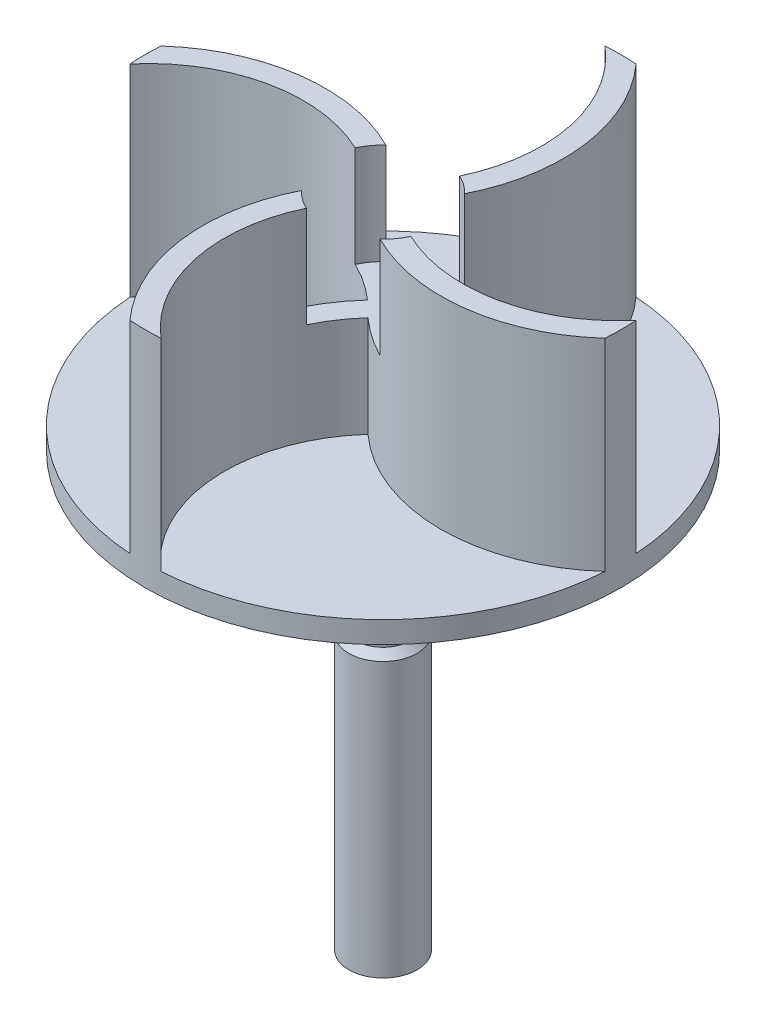
ISO-10303-21;
HEADER;
FILE_DESCRIPTION(('STEP AP214'),'2;1');
FILE_NAME('part.step','',(''),(''),'','','');
FILE_SCHEMA(('AUTOMOTIVE_DESIGN { 1 0 10303 214 1 1 1 1 }'));
ENDSEC;
DATA;
#1=APPLICATION_CONTEXT('core data for automotive mechanical design processes');
#2=APPLICATION_PROTOCOL_DEFINITION('international standard','automotive_design',2000,#1);
#3=PRODUCT_CONTEXT('',#1,'mechanical');
#4=PRODUCT('Part','Part','',(#3));
#5=PRODUCT_RELATED_PRODUCT_CATEGORY('part','',(#4));
#6=PRODUCT_DEFINITION_FORMATION('','',#4);
#7=PRODUCT_DEFINITION_CONTEXT('part definition',#1,'design');
#8=PRODUCT_DEFINITION('design','',#6,#7);
#9=PRODUCT_DEFINITION_SHAPE('','',#8);
#10=(LENGTH_UNIT() NAMED_UNIT(*) SI_UNIT(.MILLI.,.METRE.));
#11=(NAMED_UNIT(*) PLANE_ANGLE_UNIT() SI_UNIT($,.RADIAN.));
#12=(NAMED_UNIT(*) SI_UNIT($,.STERADIAN.) SOLID_ANGLE_UNIT());
#13=UNCERTAINTY_MEASURE_WITH_UNIT(LENGTH_MEASURE(1.E-05),#10,'distance_accuracy_value','');
#14=(GEOMETRIC_REPRESENTATION_CONTEXT(3) GLOBAL_UNCERTAINTY_ASSIGNED_CONTEXT((#13)) GLOBAL_UNIT_ASSIGNED_CONTEXT((#10,
#11,#12)) REPRESENTATION_CONTEXT('',''));
#15=CARTESIAN_POINT('',(0.,0.,0.));
#16=DIRECTION('',(0.,0.,1.));
#17=DIRECTION('',(1.,0.,0.));
#18=AXIS2_PLACEMENT_3D('',#15,#16,#17);
#19=CARTESIAN_POINT('',(0.,-60.,0.));
#20=DIRECTION('',(0.,1.,0.));
#21=DIRECTION('',(0.,0.,1.));
#22=AXIS2_PLACEMENT_3D('',#19,#20,#21);
#23=CYLINDRICAL_SURFACE('',#22,4.75);
#24=CARTESIAN_POINT('',(0.,-16.,0.));
#25=DIRECTION('',(0.,1.,0.));
#26=DIRECTION('',(0.,0.,1.));
#27=AXIS2_PLACEMENT_3D('',#24,#25,#26);
#28=CIRCLE('',#27,4.75);
#29=CARTESIAN_POINT('',(0.,-16.,4.75));
#30=VERTEX_POINT('',#29);
#31=EDGE_CURVE('E269',#30,#30,#28,.T.);
#32=ORIENTED_EDGE('',*,*,#31,.T.);
#33=EDGE_LOOP('',(#32));
#34=FACE_BOUND('',#33,.T.);
#35=CARTESIAN_POINT('',(0.,0.,0.));
#36=DIRECTION('',(0.,1.,0.));
#37=DIRECTION('',(0.,0.,1.));
#38=AXIS2_PLACEMENT_3D('',#35,#36,#37);
#39=CIRCLE('',#38,4.75);
#40=CARTESIAN_POINT('',(0.,0.,4.75));
#41=VERTEX_POINT('',#40);
#42=EDGE_CURVE('E11',#41,#41,#39,.F.);
#43=ORIENTED_EDGE('',*,*,#42,.T.);
#44=EDGE_LOOP('',(#43));
#45=FACE_BOUND('',#44,.T.);
#46=ADVANCED_FACE('F41',(#34,#45),#23,.T.);
#47=CARTESIAN_POINT('',(0.,31.,0.));
#48=DIRECTION('',(0.,1.,0.));
#49=DIRECTION('',(0.,0.,1.));
#50=AXIS2_PLACEMENT_3D('',#47,#48,#49);
#51=PLANE('',#50);
#52=CARTESIAN_POINT('',(0.,31.,0.));
#53=DIRECTION('',(0.,1.,0.));
#54=DIRECTION('',(0.,0.,1.));
#55=AXIS2_PLACEMENT_3D('',#52,#53,#54);
#56=CIRCLE('',#55,8.);
#57=CARTESIAN_POINT('',(5.45921478770868,31.,5.84781787521318));
#58=VERTEX_POINT('',#57);
#59=CARTESIAN_POINT('',(7.24882369672887,31.,3.38445786112666));
#60=VERTEX_POINT('',#59);
#61=EDGE_CURVE('E185',#58,#60,#56,.T.);
#62=ORIENTED_EDGE('',*,*,#61,.F.);
#63=CARTESIAN_POINT('',(16.5,31.,-16.0234203589621));
#64=DIRECTION('',(0.,1.,0.));
#65=DIRECTION('',(0.,0.,1.));
#66=AXIS2_PLACEMENT_3D('',#63,#64,#65);
#67=CIRCLE('',#66,24.5);
#68=CARTESIAN_POINT('',(32.9298196941055,31.,2.15104042586407));
#69=VERTEX_POINT('',#68);
#70=EDGE_CURVE('E198',#58,#69,#67,.T.);
#71=ORIENTED_EDGE('',*,*,#70,.T.);
#72=CARTESIAN_POINT('',(0.,31.,0.));
#73=DIRECTION('',(0.,1.,0.));
#74=DIRECTION('',(0.,0.,1.));
#75=AXIS2_PLACEMENT_3D('',#72,#73,#74);
#76=CIRCLE('',#75,33.);
#77=CARTESIAN_POINT('',(32.92953113121,31.,-2.15545342762709));
#78=VERTEX_POINT('',#77);
#79=EDGE_CURVE('E211',#69,#78,#76,.T.);
#80=ORIENTED_EDGE('',*,*,#79,.T.);
#81=CARTESIAN_POINT('',(16.5,31.,-16.0234203589621));
#82=DIRECTION('',(0.,1.,0.));
#83=DIRECTION('',(0.,0.,1.));
#84=AXIS2_PLACEMENT_3D('',#81,#82,#83);
#85=CIRCLE('',#84,21.5);
#86=EDGE_CURVE('E200',#60,#78,#85,.T.);
#87=ORIENTED_EDGE('',*,*,#86,.F.);
#88=EDGE_LOOP('',(#62,#71,#80,#87));
#89=FACE_BOUND('',#88,.T.);
#90=ADVANCED_FACE('F196',(#89),#51,.T.);
#91=CARTESIAN_POINT('',(5.84781787521316,31.,-5.4592147877087));
#92=VERTEX_POINT('',#91);
#93=CARTESIAN_POINT('',(3.38445786112664,31.,-7.24882369672888));
#94=VERTEX_POINT('',#93);
#95=EDGE_CURVE('E203',#92,#94,#56,.T.);
#96=ORIENTED_EDGE('',*,*,#95,.F.);
#97=CARTESIAN_POINT('',(-16.0234203589621,31.,-16.4999999999999));
#98=DIRECTION('',(0.,1.,0.));
#99=DIRECTION('',(1.,0.,0.));
#100=AXIS2_PLACEMENT_3D('',#97,#98,#99);
#101=CIRCLE('',#100,24.5);
#102=CARTESIAN_POINT('',(2.15104042586396,31.,-32.9298196941055));
#103=VERTEX_POINT('',#102);
#104=EDGE_CURVE('E370',#92,#103,#101,.T.);
#105=ORIENTED_EDGE('',*,*,#104,.T.);
#106=CARTESIAN_POINT('',(0.,31.,0.));
#107=DIRECTION('',(0.,1.,0.));
#108=DIRECTION('',(1.,0.,0.));
#109=AXIS2_PLACEMENT_3D('',#106,#107,#108);
#110=CIRCLE('',#109,33.);
#111=CARTESIAN_POINT('',(-2.15545342762721,31.,-32.92953113121));
#112=VERTEX_POINT('',#111);
#113=EDGE_CURVE('E374',#103,#112,#110,.T.);
#114=ORIENTED_EDGE('',*,*,#113,.T.);
#115=CARTESIAN_POINT('',(-16.0234203589621,31.,-16.4999999999999));
#116=DIRECTION('',(0.,1.,0.));
#117=DIRECTION('',(1.,0.,0.));
#118=AXIS2_PLACEMENT_3D('',#115,#116,#117);
#119=CIRCLE('',#118,21.5);
#120=EDGE_CURVE('E367',#94,#112,#119,.T.);
#121=ORIENTED_EDGE('',*,*,#120,.F.);
#122=EDGE_LOOP('',(#96,#105,#114,#121));
#123=FACE_BOUND('',#122,.T.);
#124=ADVANCED_FACE('F412',(#123),#51,.T.);
#125=CARTESIAN_POINT('',(-5.45921478770868,31.,-5.84781787521319));
#126=VERTEX_POINT('',#125);
#127=CARTESIAN_POINT('',(-7.24882369672887,31.,-3.38445786112667));
#128=VERTEX_POINT('',#127);
#129=EDGE_CURVE('E264',#126,#128,#56,.T.);
#130=ORIENTED_EDGE('',*,*,#129,.F.);
#131=CARTESIAN_POINT('',(-16.5,31.,16.0234203589621));
#132=DIRECTION('',(0.,1.,0.));
#133=DIRECTION('',(0.,0.,-1.));
#134=AXIS2_PLACEMENT_3D('',#131,#132,#133);
#135=CIRCLE('',#134,24.5);
#136=CARTESIAN_POINT('',(-32.9298196941055,31.,-2.15104042586407));
#137=VERTEX_POINT('',#136);
#138=EDGE_CURVE('E342',#126,#137,#135,.T.);
#139=ORIENTED_EDGE('',*,*,#138,.T.);
#140=CARTESIAN_POINT('',(0.,31.,0.));
#141=DIRECTION('',(0.,1.,0.));
#142=DIRECTION('',(0.,0.,-1.));
#143=AXIS2_PLACEMENT_3D('',#140,#141,#142);
#144=CIRCLE('',#143,33.);
#145=CARTESIAN_POINT('',(-32.92953113121,31.,2.15545342762709));
#146=VERTEX_POINT('',#145);
#147=EDGE_CURVE('E346',#137,#146,#144,.T.);
#148=ORIENTED_EDGE('',*,*,#147,.T.);
#149=CARTESIAN_POINT('',(-16.5,31.,16.0234203589621));
#150=DIRECTION('',(0.,1.,0.));
#151=DIRECTION('',(0.,0.,-1.));
#152=AXIS2_PLACEMENT_3D('',#149,#150,#151);
#153=CIRCLE('',#152,21.5);
#154=EDGE_CURVE('E339',#128,#146,#153,.T.);
#155=ORIENTED_EDGE('',*,*,#154,.F.);
#156=EDGE_LOOP('',(#130,#139,#148,#155));
#157=FACE_BOUND('',#156,.T.);
#158=ADVANCED_FACE('F467',(#157),#51,.T.);
#159=CARTESIAN_POINT('',(0.,3.,0.));
#160=DIRECTION('',(0.,1.,0.));
#161=DIRECTION('',(0.,0.,1.));
#162=AXIS2_PLACEMENT_3D('',#159,#160,#161);
#163=PLANE('',#162);
#164=CARTESIAN_POINT('',(0.,3.,0.));
#165=DIRECTION('',(0.,1.,0.));
#166=DIRECTION('',(0.,0.,1.));
#167=AXIS2_PLACEMENT_3D('',#164,#165,#166);
#168=CIRCLE('',#167,33.);
#169=CARTESIAN_POINT('',(32.92953113121,3.,-2.15545342762709));
#170=VERTEX_POINT('',#169);
#171=CARTESIAN_POINT('',(2.15104042586396,3.,-32.9298196941055));
#172=VERTEX_POINT('',#171);
#173=EDGE_CURVE('E233',#170,#172,#168,.T.);
#174=ORIENTED_EDGE('',*,*,#173,.T.);
#175=CARTESIAN_POINT('',(-16.0234203589621,3.,-16.4999999999999));
#176=DIRECTION('',(0.,1.,0.));
#177=DIRECTION('',(1.,0.,0.));
#178=AXIS2_PLACEMENT_3D('',#175,#176,#177);
#179=CIRCLE('',#178,24.5);
#180=CARTESIAN_POINT('',(2.12210831675991,3.,-0.0382325044194914));
#181=VERTEX_POINT('',#180);
#182=EDGE_CURVE('E371',#181,#172,#179,.T.);
#183=ORIENTED_EDGE('',*,*,#182,.F.);
#184=CARTESIAN_POINT('',(16.5,3.,-16.0234203589621));
#185=DIRECTION('',(0.,1.,0.));
#186=DIRECTION('',(0.,0.,1.));
#187=AXIS2_PLACEMENT_3D('',#184,#185,#186);
#188=CIRCLE('',#187,21.5);
#189=EDGE_CURVE('E221',#181,#170,#188,.T.);
#190=ORIENTED_EDGE('',*,*,#189,.T.);
#191=EDGE_LOOP('',(#174,#183,#190));
#192=FACE_BOUND('',#191,.T.);
#193=ADVANCED_FACE('F403',(#192),#163,.T.);
#194=CARTESIAN_POINT('',(-16.0234203589621,3.,-16.4999999999999));
#195=DIRECTION('',(0.,1.,0.));
#196=DIRECTION('',(1.,0.,0.));
#197=AXIS2_PLACEMENT_3D('',#194,#195,#196);
#198=CIRCLE('',#197,21.5);
#199=CARTESIAN_POINT('',(-0.038232504419488,3.,-2.12210831675992));
#200=VERTEX_POINT('',#199);
#201=CARTESIAN_POINT('',(-2.15545342762721,3.,-32.92953113121));
#202=VERTEX_POINT('',#201);
#203=EDGE_CURVE('E366',#200,#202,#198,.T.);
#204=ORIENTED_EDGE('',*,*,#203,.T.);
#205=CARTESIAN_POINT('',(-32.9298196941055,3.,-2.15104042586407));
#206=VERTEX_POINT('',#205);
#207=EDGE_CURVE('E238',#202,#206,#168,.T.);
#208=ORIENTED_EDGE('',*,*,#207,.T.);
#209=CARTESIAN_POINT('',(-16.5,3.,16.0234203589621));
#210=DIRECTION('',(0.,1.,0.));
#211=DIRECTION('',(0.,0.,-1.));
#212=AXIS2_PLACEMENT_3D('',#209,#210,#211);
#213=CIRCLE('',#212,24.5);
#214=EDGE_CURVE('E343',#200,#206,#213,.T.);
#215=ORIENTED_EDGE('',*,*,#214,.F.);
#216=EDGE_LOOP('',(#204,#208,#215));
#217=FACE_BOUND('',#216,.T.);
#218=ADVANCED_FACE('F445',(#217),#163,.T.);
#219=CARTESIAN_POINT('',(16.0234203589622,3.,16.4999999999998));
#220=DIRECTION('',(0.,1.,0.));
#221=DIRECTION('',(-1.,0.,0.));
#222=AXIS2_PLACEMENT_3D('',#219,#220,#221);
#223=CIRCLE('',#222,21.5);
#224=CARTESIAN_POINT('',(0.0382325044195019,3.,2.12210831675993));
#225=VERTEX_POINT('',#224);
#226=CARTESIAN_POINT('',(2.15545342762744,3.,32.92953113121));
#227=VERTEX_POINT('',#226);
#228=EDGE_CURVE('E314',#225,#227,#223,.T.);
#229=ORIENTED_EDGE('',*,*,#228,.T.);
#230=CARTESIAN_POINT('',(32.9298196941055,3.,2.15104042586407));
#231=VERTEX_POINT('',#230);
#232=EDGE_CURVE('E239',#227,#231,#168,.T.);
#233=ORIENTED_EDGE('',*,*,#232,.T.);
#234=CARTESIAN_POINT('',(16.5,3.,-16.0234203589621));
#235=DIRECTION('',(0.,1.,0.));
#236=DIRECTION('',(0.,0.,1.));
#237=AXIS2_PLACEMENT_3D('',#234,#235,#236);
#238=CIRCLE('',#237,24.5);
#239=EDGE_CURVE('E217',#225,#231,#238,.T.);
#240=ORIENTED_EDGE('',*,*,#239,.F.);
#241=EDGE_LOOP('',(#229,#233,#240));
#242=FACE_BOUND('',#241,.T.);
#243=ADVANCED_FACE('F431',(#242),#163,.T.);
#244=CARTESIAN_POINT('',(16.5,31.,-16.0234203589621));
#245=DIRECTION('',(0.,-1.,0.));
#246=DIRECTION('',(0.,0.,-1.));
#247=AXIS2_PLACEMENT_3D('',#244,#245,#246);
#248=CYLINDRICAL_SURFACE('',#247,21.5);
#249=DIRECTION('',(0.,1.,0.));
#250=VECTOR('',#249,1.);
#251=CARTESIAN_POINT('',(7.24882369672887,24.,3.38445786112666));
#252=LINE('',#251,#250);
#253=CARTESIAN_POINT('',(7.24882369672887,17.,3.38445786112667));
#254=VERTEX_POINT('',#253);
#255=EDGE_CURVE('E191',#60,#254,#252,.F.);
#256=ORIENTED_EDGE('',*,*,#255,.F.);
#257=ORIENTED_EDGE('',*,*,#86,.T.);
#258=DIRECTION('',(0.,-1.,0.));
#259=VECTOR('',#258,1.);
#260=CARTESIAN_POINT('',(32.92953113121,31.,-2.15545342762709));
#261=LINE('',#260,#259);
#262=EDGE_CURVE('E215',#78,#170,#261,.T.);
#263=ORIENTED_EDGE('',*,*,#262,.T.);
#264=ORIENTED_EDGE('',*,*,#189,.F.);
#265=DIRECTION('',(0.,-1.,0.));
#266=VECTOR('',#265,1.);
#267=CARTESIAN_POINT('',(2.12210831675991,17.,-0.0382325044194914));
#268=LINE('',#267,#266);
#269=CARTESIAN_POINT('',(2.12210831675991,17.,-0.0382325044194914));
#270=VERTEX_POINT('',#269);
#271=EDGE_CURVE('E224',#181,#270,#268,.F.);
#272=ORIENTED_EDGE('',*,*,#271,.T.);
#273=CARTESIAN_POINT('',(16.5,17.,-16.0234203589621));
#274=DIRECTION('',(0.,1.,0.));
#275=DIRECTION('',(0.,0.,1.));
#276=AXIS2_PLACEMENT_3D('',#273,#274,#275);
#277=CIRCLE('',#276,21.5);
#278=EDGE_CURVE('E285',#270,#254,#277,.T.);
#279=ORIENTED_EDGE('',*,*,#278,.T.);
#280=EDGE_LOOP('',(#256,#257,#263,#264,#272,#279));
#281=FACE_BOUND('',#280,.T.);
#282=ADVANCED_FACE('F395',(#281),#248,.F.);
#283=CARTESIAN_POINT('',(-16.5,3.,16.0234203589621));
#284=DIRECTION('',(0.,1.,0.));
#285=DIRECTION('',(0.,0.,-1.));
#286=AXIS2_PLACEMENT_3D('',#283,#284,#285);
#287=CIRCLE('',#286,21.5);
#288=CARTESIAN_POINT('',(-2.12210831675991,3.,0.0382325044194984));
#289=VERTEX_POINT('',#288);
#290=CARTESIAN_POINT('',(-32.92953113121,3.,2.15545342762709));
#291=VERTEX_POINT('',#290);
#292=EDGE_CURVE('E338',#289,#291,#287,.T.);
#293=ORIENTED_EDGE('',*,*,#292,.T.);
#294=CARTESIAN_POINT('',(-2.15104042586373,3.,32.9298196941055));
#295=VERTEX_POINT('',#294);
#296=EDGE_CURVE('E434',#291,#295,#168,.T.);
#297=ORIENTED_EDGE('',*,*,#296,.T.);
#298=CARTESIAN_POINT('',(16.0234203589622,3.,16.4999999999998));
#299=DIRECTION('',(0.,1.,0.));
#300=DIRECTION('',(-1.,0.,0.));
#301=AXIS2_PLACEMENT_3D('',#298,#299,#300);
#302=CIRCLE('',#301,24.5);
#303=EDGE_CURVE('E317',#289,#295,#302,.T.);
#304=ORIENTED_EDGE('',*,*,#303,.F.);
#305=EDGE_LOOP('',(#293,#297,#304));
#306=FACE_BOUND('',#305,.T.);
#307=ADVANCED_FACE('F469',(#306),#163,.T.);
#308=CARTESIAN_POINT('',(0.,3.,0.));
#309=DIRECTION('',(0.,-1.,0.));
#310=DIRECTION('',(0.,0.,-1.));
#311=AXIS2_PLACEMENT_3D('',#308,#309,#310);
#312=CYLINDRICAL_SURFACE('',#311,33.);
#313=ORIENTED_EDGE('',*,*,#173,.F.);
#314=ORIENTED_EDGE('',*,*,#262,.F.);
#315=ORIENTED_EDGE('',*,*,#79,.F.);
#316=DIRECTION('',(0.,-1.,0.));
#317=VECTOR('',#316,1.);
#318=CARTESIAN_POINT('',(32.9298196941055,31.,2.15104042586407));
#319=LINE('',#318,#317);
#320=EDGE_CURVE('E208',#69,#231,#319,.T.);
#321=ORIENTED_EDGE('',*,*,#320,.T.);
#322=ORIENTED_EDGE('',*,*,#232,.F.);
#323=DIRECTION('',(0.,-1.,0.));
#324=VECTOR('',#323,1.);
#325=CARTESIAN_POINT('',(2.15545342762744,31.,32.92953113121));
#326=LINE('',#325,#324);
#327=CARTESIAN_POINT('',(2.15545342762744,31.,32.92953113121));
#328=VERTEX_POINT('',#327);
#329=EDGE_CURVE('E323',#328,#227,#326,.T.);
#330=ORIENTED_EDGE('',*,*,#329,.F.);
#331=CARTESIAN_POINT('',(0.,31.,0.));
#332=DIRECTION('',(0.,1.,0.));
#333=DIRECTION('',(-1.,0.,0.));
#334=AXIS2_PLACEMENT_3D('',#331,#332,#333);
#335=CIRCLE('',#334,33.);
#336=CARTESIAN_POINT('',(-2.15104042586373,31.,32.9298196941055));
#337=VERTEX_POINT('',#336);
#338=EDGE_CURVE('E320',#337,#328,#335,.T.);
#339=ORIENTED_EDGE('',*,*,#338,.F.);
#340=DIRECTION('',(0.,-1.,0.));
#341=VECTOR('',#340,1.);
#342=CARTESIAN_POINT('',(-2.15104042586373,31.,32.9298196941055));
#343=LINE('',#342,#341);
#344=EDGE_CURVE('E331',#337,#295,#343,.T.);
#345=ORIENTED_EDGE('',*,*,#344,.T.);
#346=ORIENTED_EDGE('',*,*,#296,.F.);
#347=DIRECTION('',(0.,-1.,0.));
#348=VECTOR('',#347,1.);
#349=CARTESIAN_POINT('',(-32.92953113121,31.,2.15545342762709));
#350=LINE('',#349,#348);
#351=EDGE_CURVE('E350',#146,#291,#350,.T.);
#352=ORIENTED_EDGE('',*,*,#351,.F.);
#353=ORIENTED_EDGE('',*,*,#147,.F.);
#354=DIRECTION('',(0.,-1.,0.));
#355=VECTOR('',#354,1.);
#356=CARTESIAN_POINT('',(-32.9298196941055,31.,-2.15104042586407));
#357=LINE('',#356,#355);
#358=EDGE_CURVE('E358',#137,#206,#357,.T.);
#359=ORIENTED_EDGE('',*,*,#358,.T.);
#360=ORIENTED_EDGE('',*,*,#207,.F.);
#361=DIRECTION('',(0.,-1.,0.));
#362=VECTOR('',#361,1.);
#363=CARTESIAN_POINT('',(-2.15545342762721,31.,-32.92953113121));
#364=LINE('',#363,#362);
#365=EDGE_CURVE('E378',#112,#202,#364,.T.);
#366=ORIENTED_EDGE('',*,*,#365,.F.);
#367=ORIENTED_EDGE('',*,*,#113,.F.);
#368=DIRECTION('',(0.,-1.,0.));
#369=VECTOR('',#368,1.);
#370=CARTESIAN_POINT('',(2.15104042586396,31.,-32.9298196941055));
#371=LINE('',#370,#369);
#372=EDGE_CURVE('E386',#103,#172,#371,.T.);
#373=ORIENTED_EDGE('',*,*,#372,.T.);
#374=EDGE_LOOP('',(#313,#314,#315,#321,#322,#330,#339,#345,#346,#352,#353,#359,#360,#366,#367,#373));
#375=FACE_BOUND('',#374,.T.);
#376=CARTESIAN_POINT('',(0.,0.,0.));
#377=DIRECTION('',(0.,1.,0.));
#378=DIRECTION('',(0.,0.,1.));
#379=AXIS2_PLACEMENT_3D('',#376,#377,#378);
#380=CIRCLE('',#379,33.);
#381=CARTESIAN_POINT('',(0.,0.,33.));
#382=VERTEX_POINT('',#381);
#383=EDGE_CURVE('E232',#382,#382,#380,.T.);
#384=ORIENTED_EDGE('',*,*,#383,.T.);
#385=EDGE_LOOP('',(#384));
#386=FACE_BOUND('',#385,.T.);
#387=ADVANCED_FACE('F43',(#375,#386),#312,.T.);
#388=CARTESIAN_POINT('',(0.,0.,0.));
#389=DIRECTION('',(0.,1.,0.));
#390=DIRECTION('',(0.,0.,1.));
#391=AXIS2_PLACEMENT_3D('',#388,#389,#390);
#392=PLANE('',#391);
#393=ORIENTED_EDGE('',*,*,#42,.F.);
#394=EDGE_LOOP('',(#393));
#395=FACE_BOUND('',#394,.T.);
#396=ORIENTED_EDGE('',*,*,#383,.F.);
#397=EDGE_LOOP('',(#396));
#398=FACE_BOUND('',#397,.T.);
#399=ADVANCED_FACE('F476',(#395,#398),#392,.F.);
#400=CARTESIAN_POINT('',(16.5,31.,-16.0234203589621));
#401=DIRECTION('',(0.,-1.,0.));
#402=DIRECTION('',(0.,0.,-1.));
#403=AXIS2_PLACEMENT_3D('',#400,#401,#402);
#404=CYLINDRICAL_SURFACE('',#403,24.5);
#405=ORIENTED_EDGE('',*,*,#70,.F.);
#406=DIRECTION('',(0.,1.,0.));
#407=VECTOR('',#406,1.);
#408=CARTESIAN_POINT('',(5.45921478770868,24.,5.84781787521318));
#409=LINE('',#408,#407);
#410=CARTESIAN_POINT('',(5.45921478770868,17.,5.84781787521319));
#411=VERTEX_POINT('',#410);
#412=EDGE_CURVE('E182',#58,#411,#409,.F.);
#413=ORIENTED_EDGE('',*,*,#412,.T.);
#414=CARTESIAN_POINT('',(16.5,17.,-16.0234203589621));
#415=DIRECTION('',(0.,1.,0.));
#416=DIRECTION('',(0.,0.,1.));
#417=AXIS2_PLACEMENT_3D('',#414,#415,#416);
#418=CIRCLE('',#417,24.5);
#419=CARTESIAN_POINT('',(0.0382325044195019,17.,2.12210831675993));
#420=VERTEX_POINT('',#419);
#421=EDGE_CURVE('E293',#420,#411,#418,.T.);
#422=ORIENTED_EDGE('',*,*,#421,.F.);
#423=DIRECTION('',(0.,-1.,0.));
#424=VECTOR('',#423,1.);
#425=CARTESIAN_POINT('',(0.0382325044194984,17.,2.12210831675993));
#426=LINE('',#425,#424);
#427=EDGE_CURVE('E65',#420,#225,#426,.T.);
#428=ORIENTED_EDGE('',*,*,#427,.T.);
#429=ORIENTED_EDGE('',*,*,#239,.T.);
#430=ORIENTED_EDGE('',*,*,#320,.F.);
#431=EDGE_LOOP('',(#405,#413,#422,#428,#429,#430));
#432=FACE_BOUND('',#431,.T.);
#433=ADVANCED_FACE('F206',(#432),#404,.T.);
#434=CARTESIAN_POINT('',(-5.84781787521313,31.,5.45921478770875));
#435=VERTEX_POINT('',#434);
#436=CARTESIAN_POINT('',(-3.38445786112659,31.,7.2488236967289));
#437=VERTEX_POINT('',#436);
#438=EDGE_CURVE('E205',#435,#437,#56,.T.);
#439=ORIENTED_EDGE('',*,*,#438,.F.);
#440=CARTESIAN_POINT('',(16.0234203589622,31.,16.4999999999998));
#441=DIRECTION('',(0.,1.,0.));
#442=DIRECTION('',(-1.,0.,0.));
#443=AXIS2_PLACEMENT_3D('',#440,#441,#442);
#444=CIRCLE('',#443,24.5);
#445=EDGE_CURVE('E251',#435,#337,#444,.T.);
#446=ORIENTED_EDGE('',*,*,#445,.T.);
#447=ORIENTED_EDGE('',*,*,#338,.T.);
#448=CARTESIAN_POINT('',(16.0234203589622,31.,16.4999999999998));
#449=DIRECTION('',(0.,1.,0.));
#450=DIRECTION('',(-1.,0.,0.));
#451=AXIS2_PLACEMENT_3D('',#448,#449,#450);
#452=CIRCLE('',#451,21.5);
#453=EDGE_CURVE('E262',#437,#328,#452,.T.);
#454=ORIENTED_EDGE('',*,*,#453,.F.);
#455=EDGE_LOOP('',(#439,#446,#447,#454));
#456=FACE_BOUND('',#455,.T.);
#457=ADVANCED_FACE('F260',(#456),#51,.T.);
#458=CARTESIAN_POINT('',(16.0234203589622,31.,16.4999999999998));
#459=DIRECTION('',(0.,-1.,0.));
#460=DIRECTION('',(0.,0.,-1.));
#461=AXIS2_PLACEMENT_3D('',#458,#459,#460);
#462=CYLINDRICAL_SURFACE('',#461,21.5);
#463=DIRECTION('',(0.,1.,0.));
#464=VECTOR('',#463,1.);
#465=CARTESIAN_POINT('',(-3.38445786112659,24.,7.2488236967289));
#466=LINE('',#465,#464);
#467=CARTESIAN_POINT('',(-3.38445786112659,17.,7.2488236967289));
#468=VERTEX_POINT('',#467);
#469=EDGE_CURVE('E192',#437,#468,#466,.F.);
#470=ORIENTED_EDGE('',*,*,#469,.F.);
#471=ORIENTED_EDGE('',*,*,#453,.T.);
#472=ORIENTED_EDGE('',*,*,#329,.T.);
#473=ORIENTED_EDGE('',*,*,#228,.F.);
#474=ORIENTED_EDGE('',*,*,#427,.F.);
#475=CARTESIAN_POINT('',(16.0234203589622,17.,16.4999999999998));
#476=DIRECTION('',(0.,1.,0.));
#477=DIRECTION('',(0.,0.,1.));
#478=AXIS2_PLACEMENT_3D('',#475,#476,#477);
#479=CIRCLE('',#478,21.5);
#480=EDGE_CURVE('E289',#420,#468,#479,.T.);
#481=ORIENTED_EDGE('',*,*,#480,.T.);
#482=EDGE_LOOP('',(#470,#471,#472,#473,#474,#481));
#483=FACE_BOUND('',#482,.T.);
#484=ADVANCED_FACE('F426',(#483),#462,.F.);
#485=CARTESIAN_POINT('',(-16.0234203589621,31.,-16.4999999999999));
#486=DIRECTION('',(0.,-1.,0.));
#487=DIRECTION('',(0.,0.,-1.));
#488=AXIS2_PLACEMENT_3D('',#485,#486,#487);
#489=CYLINDRICAL_SURFACE('',#488,21.5);
#490=DIRECTION('',(0.,1.,0.));
#491=VECTOR('',#490,1.);
#492=CARTESIAN_POINT('',(3.38445786112664,24.,-7.24882369672888));
#493=LINE('',#492,#491);
#494=CARTESIAN_POINT('',(3.38445786112664,17.,-7.24882369672888));
#495=VERTEX_POINT('',#494);
#496=EDGE_CURVE('E307',#94,#495,#493,.F.);
#497=ORIENTED_EDGE('',*,*,#496,.F.);
#498=ORIENTED_EDGE('',*,*,#120,.T.);
#499=ORIENTED_EDGE('',*,*,#365,.T.);
#500=ORIENTED_EDGE('',*,*,#203,.F.);
#501=DIRECTION('',(0.,-1.,0.));
#502=VECTOR('',#501,1.);
#503=CARTESIAN_POINT('',(-0.038232504419488,17.,-2.12210831675992));
#504=LINE('',#503,#502);
#505=CARTESIAN_POINT('',(-0.038232504419488,17.,-2.12210831675992));
#506=VERTEX_POINT('',#505);
#507=EDGE_CURVE('E362',#200,#506,#504,.F.);
#508=ORIENTED_EDGE('',*,*,#507,.T.);
#509=CARTESIAN_POINT('',(-16.0234203589621,17.,-16.4999999999999));
#510=DIRECTION('',(0.,1.,0.));
#511=DIRECTION('',(0.,0.,1.));
#512=AXIS2_PLACEMENT_3D('',#509,#510,#511);
#513=CIRCLE('',#512,21.5);
#514=EDGE_CURVE('E278',#506,#495,#513,.T.);
#515=ORIENTED_EDGE('',*,*,#514,.T.);
#516=EDGE_LOOP('',(#497,#498,#499,#500,#508,#515));
#517=FACE_BOUND('',#516,.T.);
#518=ADVANCED_FACE('F455',(#517),#489,.F.);
#519=CARTESIAN_POINT('',(-16.0234203589621,31.,-16.4999999999999));
#520=DIRECTION('',(0.,-1.,0.));
#521=DIRECTION('',(0.,0.,-1.));
#522=AXIS2_PLACEMENT_3D('',#519,#520,#521);
#523=CYLINDRICAL_SURFACE('',#522,24.5);
#524=ORIENTED_EDGE('',*,*,#104,.F.);
#525=DIRECTION('',(0.,1.,0.));
#526=VECTOR('',#525,1.);
#527=CARTESIAN_POINT('',(5.84781787521316,24.,-5.4592147877087));
#528=LINE('',#527,#526);
#529=CARTESIAN_POINT('',(5.84781787521316,17.,-5.4592147877087));
#530=VERTEX_POINT('',#529);
#531=EDGE_CURVE('E303',#92,#530,#528,.F.);
#532=ORIENTED_EDGE('',*,*,#531,.T.);
#533=CARTESIAN_POINT('',(-16.0234203589621,17.,-16.4999999999999));
#534=DIRECTION('',(0.,1.,0.));
#535=DIRECTION('',(0.,0.,1.));
#536=AXIS2_PLACEMENT_3D('',#533,#534,#535);
#537=CIRCLE('',#536,24.5);
#538=EDGE_CURVE('E282',#270,#530,#537,.T.);
#539=ORIENTED_EDGE('',*,*,#538,.F.);
#540=ORIENTED_EDGE('',*,*,#271,.F.);
#541=ORIENTED_EDGE('',*,*,#182,.T.);
#542=ORIENTED_EDGE('',*,*,#372,.F.);
#543=EDGE_LOOP('',(#524,#532,#539,#540,#541,#542));
#544=FACE_BOUND('',#543,.T.);
#545=ADVANCED_FACE('F400',(#544),#523,.T.);
#546=CARTESIAN_POINT('',(-16.5,31.,16.0234203589621));
#547=DIRECTION('',(0.,-1.,0.));
#548=DIRECTION('',(0.,0.,-1.));
#549=AXIS2_PLACEMENT_3D('',#546,#547,#548);
#550=CYLINDRICAL_SURFACE('',#549,21.5);
#551=DIRECTION('',(0.,1.,0.));
#552=VECTOR('',#551,1.);
#553=CARTESIAN_POINT('',(-7.24882369672887,24.,-3.38445786112666));
#554=LINE('',#553,#552);
#555=CARTESIAN_POINT('',(-7.24882369672887,17.,-3.38445786112667));
#556=VERTEX_POINT('',#555);
#557=EDGE_CURVE('E300',#128,#556,#554,.F.);
#558=ORIENTED_EDGE('',*,*,#557,.F.);
#559=ORIENTED_EDGE('',*,*,#154,.T.);
#560=ORIENTED_EDGE('',*,*,#351,.T.);
#561=ORIENTED_EDGE('',*,*,#292,.F.);
#562=DIRECTION('',(0.,-1.,0.));
#563=VECTOR('',#562,1.);
#564=CARTESIAN_POINT('',(-2.1221083167599,17.,0.0382325044195019));
#565=LINE('',#564,#563);
#566=CARTESIAN_POINT('',(-2.1221083167599,17.,0.0382325044195019));
#567=VERTEX_POINT('',#566);
#568=EDGE_CURVE('E335',#289,#567,#565,.F.);
#569=ORIENTED_EDGE('',*,*,#568,.T.);
#570=CARTESIAN_POINT('',(-16.5,17.,16.0234203589621));
#571=DIRECTION('',(0.,1.,0.));
#572=DIRECTION('',(0.,0.,1.));
#573=AXIS2_PLACEMENT_3D('',#570,#571,#572);
#574=CIRCLE('',#573,21.5);
#575=EDGE_CURVE('E57',#567,#556,#574,.T.);
#576=ORIENTED_EDGE('',*,*,#575,.T.);
#577=EDGE_LOOP('',(#558,#559,#560,#561,#569,#576));
#578=FACE_BOUND('',#577,.T.);
#579=ADVANCED_FACE('F465',(#578),#550,.F.);
#580=CARTESIAN_POINT('',(-16.5,31.,16.0234203589621));
#581=DIRECTION('',(0.,-1.,0.));
#582=DIRECTION('',(0.,0.,-1.));
#583=AXIS2_PLACEMENT_3D('',#580,#581,#582);
#584=CYLINDRICAL_SURFACE('',#583,24.5);
#585=ORIENTED_EDGE('',*,*,#138,.F.);
#586=DIRECTION('',(0.,1.,0.));
#587=VECTOR('',#586,1.);
#588=CARTESIAN_POINT('',(-5.45921478770868,24.,-5.84781787521318));
#589=LINE('',#588,#587);
#590=CARTESIAN_POINT('',(-5.45921478770868,17.,-5.84781787521319));
#591=VERTEX_POINT('',#590);
#592=EDGE_CURVE('E296',#126,#591,#589,.F.);
#593=ORIENTED_EDGE('',*,*,#592,.T.);
#594=CARTESIAN_POINT('',(-16.5,17.,16.0234203589621));
#595=DIRECTION('',(0.,1.,0.));
#596=DIRECTION('',(0.,0.,1.));
#597=AXIS2_PLACEMENT_3D('',#594,#595,#596);
#598=CIRCLE('',#597,24.5);
#599=EDGE_CURVE('E275',#506,#591,#598,.T.);
#600=ORIENTED_EDGE('',*,*,#599,.F.);
#601=ORIENTED_EDGE('',*,*,#507,.F.);
#602=ORIENTED_EDGE('',*,*,#214,.T.);
#603=ORIENTED_EDGE('',*,*,#358,.F.);
#604=EDGE_LOOP('',(#585,#593,#600,#601,#602,#603));
#605=FACE_BOUND('',#604,.T.);
#606=ADVANCED_FACE('F452',(#605),#584,.T.);
#607=CARTESIAN_POINT('',(16.0234203589622,31.,16.4999999999998));
#608=DIRECTION('',(0.,-1.,0.));
#609=DIRECTION('',(0.,0.,-1.));
#610=AXIS2_PLACEMENT_3D('',#607,#608,#609);
#611=CYLINDRICAL_SURFACE('',#610,24.5);
#612=ORIENTED_EDGE('',*,*,#445,.F.);
#613=DIRECTION('',(0.,1.,0.));
#614=VECTOR('',#613,1.);
#615=CARTESIAN_POINT('',(-5.84781787521313,24.,5.45921478770875));
#616=LINE('',#615,#614);
#617=CARTESIAN_POINT('',(-5.84781787521313,17.,5.45921478770875));
#618=VERTEX_POINT('',#617);
#619=EDGE_CURVE('E50',#435,#618,#616,.F.);
#620=ORIENTED_EDGE('',*,*,#619,.T.);
#621=CARTESIAN_POINT('',(16.0234203589622,17.,16.4999999999998));
#622=DIRECTION('',(0.,1.,0.));
#623=DIRECTION('',(0.,0.,1.));
#624=AXIS2_PLACEMENT_3D('',#621,#622,#623);
#625=CIRCLE('',#624,24.5);
#626=EDGE_CURVE('E237',#567,#618,#625,.T.);
#627=ORIENTED_EDGE('',*,*,#626,.F.);
#628=ORIENTED_EDGE('',*,*,#568,.F.);
#629=ORIENTED_EDGE('',*,*,#303,.T.);
#630=ORIENTED_EDGE('',*,*,#344,.F.);
#631=EDGE_LOOP('',(#612,#620,#627,#628,#629,#630));
#632=FACE_BOUND('',#631,.T.);
#633=ADVANCED_FACE('F248',(#632),#611,.T.);
#634=CARTESIAN_POINT('',(0.,17.,0.));
#635=DIRECTION('',(0.,1.,0.));
#636=DIRECTION('',(0.,0.,1.));
#637=AXIS2_PLACEMENT_3D('',#634,#635,#636);
#638=CYLINDRICAL_SURFACE('',#637,8.);
#639=ORIENTED_EDGE('',*,*,#255,.T.);
#640=CARTESIAN_POINT('',(0.,17.,0.));
#641=DIRECTION('',(0.,1.,0.));
#642=DIRECTION('',(0.,0.,1.));
#643=AXIS2_PLACEMENT_3D('',#640,#641,#642);
#644=CIRCLE('',#643,8.);
#645=EDGE_CURVE('E188',#411,#254,#644,.T.);
#646=ORIENTED_EDGE('',*,*,#645,.F.);
#647=ORIENTED_EDGE('',*,*,#412,.F.);
#648=ORIENTED_EDGE('',*,*,#61,.T.);
#649=EDGE_LOOP('',(#639,#646,#647,#648));
#650=FACE_BOUND('',#649,.T.);
#651=ADVANCED_FACE('F184',(#650),#638,.F.);
#652=ORIENTED_EDGE('',*,*,#496,.T.);
#653=EDGE_CURVE('E421',#530,#495,#644,.T.);
#654=ORIENTED_EDGE('',*,*,#653,.F.);
#655=ORIENTED_EDGE('',*,*,#531,.F.);
#656=ORIENTED_EDGE('',*,*,#95,.T.);
#657=EDGE_LOOP('',(#652,#654,#655,#656));
#658=FACE_BOUND('',#657,.T.);
#659=ADVANCED_FACE('F457',(#658),#638,.F.);
#660=ORIENTED_EDGE('',*,*,#557,.T.);
#661=EDGE_CURVE('E419',#591,#556,#644,.T.);
#662=ORIENTED_EDGE('',*,*,#661,.F.);
#663=ORIENTED_EDGE('',*,*,#592,.F.);
#664=ORIENTED_EDGE('',*,*,#129,.T.);
#665=EDGE_LOOP('',(#660,#662,#663,#664));
#666=FACE_BOUND('',#665,.T.);
#667=ADVANCED_FACE('F460',(#666),#638,.F.);
#668=CARTESIAN_POINT('',(0.,17.,0.));
#669=DIRECTION('',(0.,1.,0.));
#670=DIRECTION('',(0.,0.,1.));
#671=AXIS2_PLACEMENT_3D('',#668,#669,#670);
#672=PLANE('',#671);
#673=ORIENTED_EDGE('',*,*,#421,.T.);
#674=ORIENTED_EDGE('',*,*,#645,.T.);
#675=ORIENTED_EDGE('',*,*,#278,.F.);
#676=ORIENTED_EDGE('',*,*,#538,.T.);
#677=ORIENTED_EDGE('',*,*,#653,.T.);
#678=ORIENTED_EDGE('',*,*,#514,.F.);
#679=ORIENTED_EDGE('',*,*,#599,.T.);
#680=ORIENTED_EDGE('',*,*,#661,.T.);
#681=ORIENTED_EDGE('',*,*,#575,.F.);
#682=ORIENTED_EDGE('',*,*,#626,.T.);
#683=EDGE_CURVE('E202',#618,#468,#644,.T.);
#684=ORIENTED_EDGE('',*,*,#683,.T.);
#685=ORIENTED_EDGE('',*,*,#480,.F.);
#686=EDGE_LOOP('',(#673,#674,#675,#676,#677,#678,#679,#680,#681,#682,#684,#685));
#687=FACE_BOUND('',#686,.T.);
#688=ADVANCED_FACE('F424',(#687),#672,.T.);
#689=ORIENTED_EDGE('',*,*,#469,.T.);
#690=ORIENTED_EDGE('',*,*,#683,.F.);
#691=ORIENTED_EDGE('',*,*,#619,.F.);
#692=ORIENTED_EDGE('',*,*,#438,.T.);
#693=EDGE_LOOP('',(#689,#690,#691,#692));
#694=FACE_BOUND('',#693,.T.);
#695=ADVANCED_FACE('F255',(#694),#638,.F.);
#696=CARTESIAN_POINT('',(0.,-17.,0.));
#697=DIRECTION('',(0.,1.,0.));
#698=DIRECTION('',(0.,0.,1.));
#699=AXIS2_PLACEMENT_3D('',#696,#697,#698);
#700=CONICAL_SURFACE('',#699,3.75,0.785398163397443);
#701=ORIENTED_EDGE('',*,*,#31,.F.);
#702=EDGE_LOOP('',(#701));
#703=FACE_BOUND('',#702,.T.);
#704=CARTESIAN_POINT('',(0.,-17.,0.));
#705=DIRECTION('',(0.,1.,0.));
#706=DIRECTION('',(0.,0.,1.));
#707=AXIS2_PLACEMENT_3D('',#704,#705,#706);
#708=CIRCLE('',#707,3.75);
#709=CARTESIAN_POINT('',(0.,-17.,3.75));
#710=VERTEX_POINT('',#709);
#711=EDGE_CURVE('E513',#710,#710,#708,.T.);
#712=ORIENTED_EDGE('',*,*,#711,.T.);
#713=EDGE_LOOP('',(#712));
#714=FACE_BOUND('',#713,.T.);
#715=ADVANCED_FACE('F522',(#703,#714),#700,.T.);
#716=CARTESIAN_POINT('',(0.,0.,0.));
#717=DIRECTION('',(0.,1.,0.));
#718=DIRECTION('',(0.,0.,1.));
#719=AXIS2_PLACEMENT_3D('',#716,#717,#718);
#720=CYLINDRICAL_SURFACE('',#719,3.75);
#721=ORIENTED_EDGE('',*,*,#711,.F.);
#722=EDGE_LOOP('',(#721));
#723=FACE_BOUND('',#722,.T.);
#724=CARTESIAN_POINT('',(0.,-21.,0.));
#725=DIRECTION('',(0.,1.,0.));
#726=DIRECTION('',(0.,0.,1.));
#727=AXIS2_PLACEMENT_3D('',#724,#725,#726);
#728=CIRCLE('',#727,3.75);
#729=CARTESIAN_POINT('',(0.,-21.,3.75));
#730=VERTEX_POINT('',#729);
#731=EDGE_CURVE('E509',#730,#730,#728,.T.);
#732=ORIENTED_EDGE('',*,*,#731,.T.);
#733=EDGE_LOOP('',(#732));
#734=FACE_BOUND('',#733,.T.);
#735=ADVANCED_FACE('F524',(#723,#734),#720,.T.);
#736=CARTESIAN_POINT('',(0.,-22.,0.));
#737=DIRECTION('',(0.,-1.,0.));
#738=DIRECTION('',(0.,0.,-1.));
#739=AXIS2_PLACEMENT_3D('',#736,#737,#738);
#740=CONICAL_SURFACE('',#739,4.75,0.785398163397452);
#741=ORIENTED_EDGE('',*,*,#731,.F.);
#742=EDGE_LOOP('',(#741));
#743=FACE_BOUND('',#742,.T.);
#744=CARTESIAN_POINT('',(0.,-22.,0.));
#745=DIRECTION('',(0.,1.,0.));
#746=DIRECTION('',(0.,0.,1.));
#747=AXIS2_PLACEMENT_3D('',#744,#745,#746);
#748=CIRCLE('',#747,4.75);
#749=CARTESIAN_POINT('',(0.,-22.,4.75));
#750=VERTEX_POINT('',#749);
#751=EDGE_CURVE('E505',#750,#750,#748,.T.);
#752=ORIENTED_EDGE('',*,*,#751,.T.);
#753=EDGE_LOOP('',(#752));
#754=FACE_BOUND('',#753,.T.);
#755=ADVANCED_FACE('F500',(#743,#754),#740,.T.);
#756=CARTESIAN_POINT('',(0.,-60.,0.));
#757=DIRECTION('',(0.,-1.,0.));
#758=DIRECTION('',(0.,0.,-1.));
#759=AXIS2_PLACEMENT_3D('',#756,#757,#758);
#760=PLANE('',#759);
#761=CARTESIAN_POINT('',(0.,-60.,0.));
#762=DIRECTION('',(0.,-1.,0.));
#763=DIRECTION('',(0.,0.,-1.));
#764=AXIS2_PLACEMENT_3D('',#761,#762,#763);
#765=CIRCLE('',#764,4.75);
#766=CARTESIAN_POINT('',(0.,-60.,-4.75));
#767=VERTEX_POINT('',#766);
#768=EDGE_CURVE('E265',#767,#767,#765,.T.);
#769=ORIENTED_EDGE('',*,*,#768,.T.);
#770=EDGE_LOOP('',(#769));
#771=FACE_BOUND('',#770,.T.);
#772=ADVANCED_FACE('F495',(#771),#760,.T.);
#773=ORIENTED_EDGE('',*,*,#751,.F.);
#774=EDGE_LOOP('',(#773));
#775=FACE_BOUND('',#774,.T.);
#776=ORIENTED_EDGE('',*,*,#768,.F.);
#777=EDGE_LOOP('',(#776));
#778=FACE_BOUND('',#777,.T.);
#779=ADVANCED_FACE('F483',(#775,#778),#23,.T.);
#780=CLOSED_SHELL('',(#46,#90,#124,#158,#193,#218,#243,#282,#307,#387,#399,#433,#457,#484,#518,
#545,#579,#606,#633,#651,#659,#667,#688,#695,#715,#735,#755,#772,#779));
#781=MANIFOLD_SOLID_BREP('B2',#780);
#782=ADVANCED_BREP_SHAPE_REPRESENTATION('',(#18,#781),#14);
#783=SHAPE_DEFINITION_REPRESENTATION(#9,#782);
ENDSEC;
END-ISO-10303-21;
